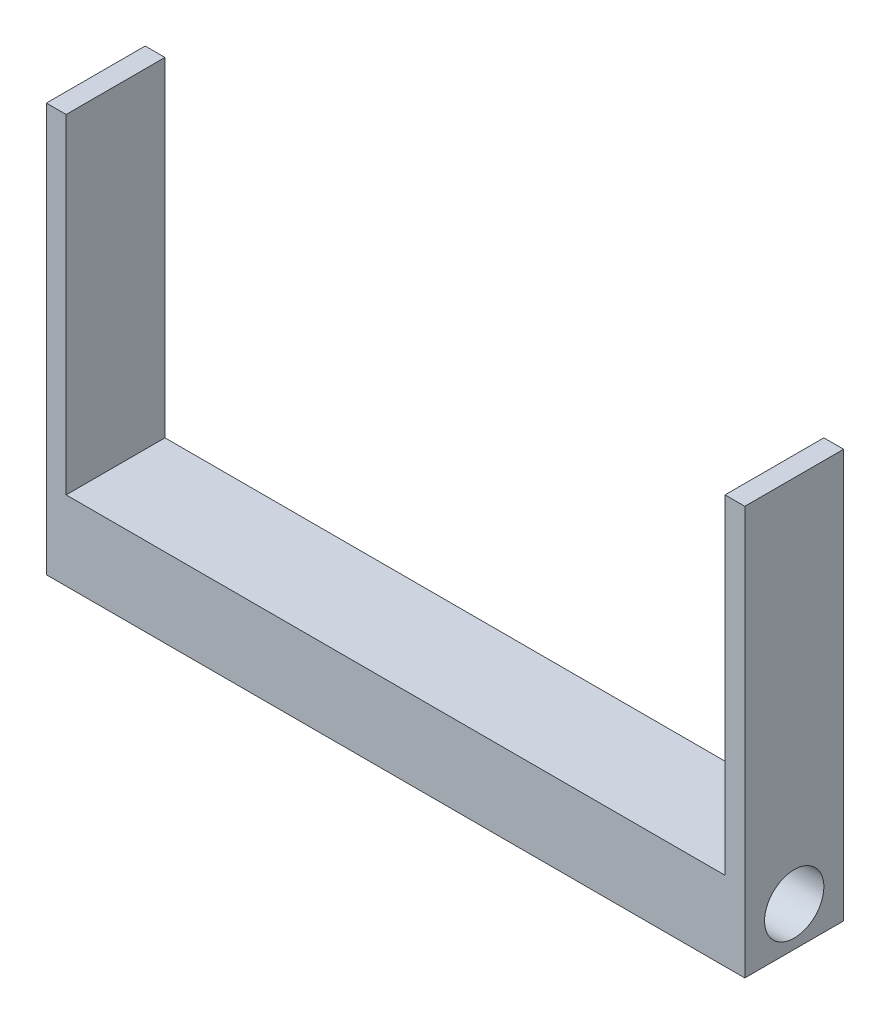
ISO-10303-21;
HEADER;
FILE_DESCRIPTION(('STEP AP214'),'2;1');
FILE_NAME('part.step','',(''),(''),'','','');
FILE_SCHEMA(('AUTOMOTIVE_DESIGN { 1 0 10303 214 1 1 1 1 }'));
ENDSEC;
DATA;
#1=APPLICATION_CONTEXT('core data for automotive mechanical design processes');
#2=APPLICATION_PROTOCOL_DEFINITION('international standard','automotive_design',2000,#1);
#3=PRODUCT_CONTEXT('',#1,'mechanical');
#4=PRODUCT('Part','Part','',(#3));
#5=PRODUCT_RELATED_PRODUCT_CATEGORY('part','',(#4));
#6=PRODUCT_DEFINITION_FORMATION('','',#4);
#7=PRODUCT_DEFINITION_CONTEXT('part definition',#1,'design');
#8=PRODUCT_DEFINITION('design','',#6,#7);
#9=PRODUCT_DEFINITION_SHAPE('','',#8);
#10=(LENGTH_UNIT() NAMED_UNIT(*) SI_UNIT(.MILLI.,.METRE.));
#11=(NAMED_UNIT(*) PLANE_ANGLE_UNIT() SI_UNIT($,.RADIAN.));
#12=(NAMED_UNIT(*) SI_UNIT($,.STERADIAN.) SOLID_ANGLE_UNIT());
#13=UNCERTAINTY_MEASURE_WITH_UNIT(LENGTH_MEASURE(1.E-05),#10,'distance_accuracy_value','');
#14=(GEOMETRIC_REPRESENTATION_CONTEXT(3) GLOBAL_UNCERTAINTY_ASSIGNED_CONTEXT((#13)) GLOBAL_UNIT_ASSIGNED_CONTEXT((#10,
#11,#12)) REPRESENTATION_CONTEXT('',''));
#15=CARTESIAN_POINT('',(0.,0.,0.));
#16=DIRECTION('',(0.,0.,1.));
#17=DIRECTION('',(1.,0.,0.));
#18=AXIS2_PLACEMENT_3D('',#15,#16,#17);
#19=CARTESIAN_POINT('',(53.,-50.,7.5));
#20=DIRECTION('',(-1.,0.,0.));
#21=DIRECTION('',(0.,-1.,0.));
#22=AXIS2_PLACEMENT_3D('',#19,#20,#21);
#23=PLANE('',#22);
#24=CARTESIAN_POINT('',(53.,-56.,0.));
#25=DIRECTION('',(1.,0.,0.));
#26=DIRECTION('',(0.,1.,0.));
#27=AXIS2_PLACEMENT_3D('',#24,#25,#26);
#28=CIRCLE('',#27,4.5);
#29=CARTESIAN_POINT('',(53.,-51.5,0.));
#30=VERTEX_POINT('',#29);
#31=EDGE_CURVE('E179',#30,#30,#28,.T.);
#32=ORIENTED_EDGE('',*,*,#31,.F.);
#33=EDGE_LOOP('',(#32));
#34=FACE_BOUND('',#33,.T.);
#35=DIRECTION('',(0.,1.,0.));
#36=VECTOR('',#35,1.);
#37=CARTESIAN_POINT('',(53.,-50.,-7.5));
#38=LINE('',#37,#36);
#39=CARTESIAN_POINT('',(53.,-62.,-7.5));
#40=VERTEX_POINT('',#39);
#41=CARTESIAN_POINT('',(53.,0.,-7.5));
#42=VERTEX_POINT('',#41);
#43=EDGE_CURVE('E129',#40,#42,#38,.T.);
#44=ORIENTED_EDGE('',*,*,#43,.T.);
#45=DIRECTION('',(0.,0.,-1.));
#46=VECTOR('',#45,1.);
#47=CARTESIAN_POINT('',(53.,0.,7.5));
#48=LINE('',#47,#46);
#49=CARTESIAN_POINT('',(53.,0.,7.5));
#50=VERTEX_POINT('',#49);
#51=EDGE_CURVE('E11',#50,#42,#48,.T.);
#52=ORIENTED_EDGE('',*,*,#51,.F.);
#53=DIRECTION('',(0.,1.,0.));
#54=VECTOR('',#53,1.);
#55=CARTESIAN_POINT('',(53.,-50.,7.5));
#56=LINE('',#55,#54);
#57=CARTESIAN_POINT('',(53.,-62.,7.5));
#58=VERTEX_POINT('',#57);
#59=EDGE_CURVE('E88',#58,#50,#56,.T.);
#60=ORIENTED_EDGE('',*,*,#59,.F.);
#61=DIRECTION('',(0.,0.,1.));
#62=VECTOR('',#61,1.);
#63=CARTESIAN_POINT('',(53.,-62.,-7.5));
#64=LINE('',#63,#62);
#65=EDGE_CURVE('E183',#40,#58,#64,.T.);
#66=ORIENTED_EDGE('',*,*,#65,.F.);
#67=EDGE_LOOP('',(#44,#52,#60,#66));
#68=FACE_BOUND('',#67,.T.);
#69=ADVANCED_FACE('F39',(#34,#68),#23,.F.);
#70=CARTESIAN_POINT('',(50.,0.,7.5));
#71=DIRECTION('',(0.,1.,0.));
#72=DIRECTION('',(0.,0.,1.));
#73=AXIS2_PLACEMENT_3D('',#70,#71,#72);
#74=PLANE('',#73);
#75=DIRECTION('',(1.,0.,0.));
#76=VECTOR('',#75,1.);
#77=CARTESIAN_POINT('',(50.,0.,-7.5));
#78=LINE('',#77,#76);
#79=CARTESIAN_POINT('',(50.,0.,-7.5));
#80=VERTEX_POINT('',#79);
#81=EDGE_CURVE('E132',#80,#42,#78,.T.);
#82=ORIENTED_EDGE('',*,*,#81,.F.);
#83=DIRECTION('',(0.,0.,-1.));
#84=VECTOR('',#83,1.);
#85=CARTESIAN_POINT('',(50.,0.,7.5));
#86=LINE('',#85,#84);
#87=CARTESIAN_POINT('',(50.,0.,7.5));
#88=VERTEX_POINT('',#87);
#89=EDGE_CURVE('E47',#88,#80,#86,.T.);
#90=ORIENTED_EDGE('',*,*,#89,.F.);
#91=DIRECTION('',(1.,0.,0.));
#92=VECTOR('',#91,1.);
#93=CARTESIAN_POINT('',(50.,0.,7.5));
#94=LINE('',#93,#92);
#95=EDGE_CURVE('E203',#88,#50,#94,.T.);
#96=ORIENTED_EDGE('',*,*,#95,.T.);
#97=ORIENTED_EDGE('',*,*,#51,.T.);
#98=EDGE_LOOP('',(#82,#90,#96,#97));
#99=FACE_BOUND('',#98,.T.);
#100=ADVANCED_FACE('F155',(#99),#74,.T.);
#101=CARTESIAN_POINT('',(50.,-50.,7.5));
#102=DIRECTION('',(-1.,0.,0.));
#103=DIRECTION('',(0.,-1.,0.));
#104=AXIS2_PLACEMENT_3D('',#101,#102,#103);
#105=PLANE('',#104);
#106=DIRECTION('',(0.,1.,0.));
#107=VECTOR('',#106,1.);
#108=CARTESIAN_POINT('',(50.,-50.,-7.5));
#109=LINE('',#108,#107);
#110=CARTESIAN_POINT('',(50.,-50.,-7.5));
#111=VERTEX_POINT('',#110);
#112=EDGE_CURVE('E136',#111,#80,#109,.T.);
#113=ORIENTED_EDGE('',*,*,#112,.F.);
#114=DIRECTION('',(0.,0.,-1.));
#115=VECTOR('',#114,1.);
#116=CARTESIAN_POINT('',(50.,-50.,7.5));
#117=LINE('',#116,#115);
#118=CARTESIAN_POINT('',(50.,-50.,7.5));
#119=VERTEX_POINT('',#118);
#120=EDGE_CURVE('E110',#119,#111,#117,.T.);
#121=ORIENTED_EDGE('',*,*,#120,.F.);
#122=DIRECTION('',(0.,1.,0.));
#123=VECTOR('',#122,1.);
#124=CARTESIAN_POINT('',(50.,-50.,7.5));
#125=LINE('',#124,#123);
#126=EDGE_CURVE('E118',#119,#88,#125,.T.);
#127=ORIENTED_EDGE('',*,*,#126,.T.);
#128=ORIENTED_EDGE('',*,*,#89,.T.);
#129=EDGE_LOOP('',(#113,#121,#127,#128));
#130=FACE_BOUND('',#129,.T.);
#131=ADVANCED_FACE('F152',(#130),#105,.T.);
#132=CARTESIAN_POINT('',(-50.,-50.,7.5));
#133=DIRECTION('',(0.,1.,0.));
#134=DIRECTION('',(-1.,0.,0.));
#135=AXIS2_PLACEMENT_3D('',#132,#133,#134);
#136=PLANE('',#135);
#137=DIRECTION('',(1.,0.,0.));
#138=VECTOR('',#137,1.);
#139=CARTESIAN_POINT('',(-50.,-50.,-7.5));
#140=LINE('',#139,#138);
#141=CARTESIAN_POINT('',(-50.,-50.,-7.5));
#142=VERTEX_POINT('',#141);
#143=EDGE_CURVE('E106',#142,#111,#140,.T.);
#144=ORIENTED_EDGE('',*,*,#143,.F.);
#145=DIRECTION('',(0.,0.,-1.));
#146=VECTOR('',#145,1.);
#147=CARTESIAN_POINT('',(-50.,-50.,7.5));
#148=LINE('',#147,#146);
#149=CARTESIAN_POINT('',(-50.,-50.,7.5));
#150=VERTEX_POINT('',#149);
#151=EDGE_CURVE('E101',#150,#142,#148,.T.);
#152=ORIENTED_EDGE('',*,*,#151,.F.);
#153=DIRECTION('',(1.,0.,0.));
#154=VECTOR('',#153,1.);
#155=CARTESIAN_POINT('',(-50.,-50.,7.5));
#156=LINE('',#155,#154);
#157=EDGE_CURVE('E104',#150,#119,#156,.T.);
#158=ORIENTED_EDGE('',*,*,#157,.T.);
#159=ORIENTED_EDGE('',*,*,#120,.T.);
#160=EDGE_LOOP('',(#144,#152,#158,#159));
#161=FACE_BOUND('',#160,.T.);
#162=ADVANCED_FACE('F103',(#161),#136,.T.);
#163=CARTESIAN_POINT('',(-50.,0.,7.5));
#164=DIRECTION('',(1.,0.,0.));
#165=DIRECTION('',(0.,1.,0.));
#166=AXIS2_PLACEMENT_3D('',#163,#164,#165);
#167=PLANE('',#166);
#168=DIRECTION('',(0.,-1.,0.));
#169=VECTOR('',#168,1.);
#170=CARTESIAN_POINT('',(-50.,0.,-7.5));
#171=LINE('',#170,#169);
#172=CARTESIAN_POINT('',(-50.,0.,-7.5));
#173=VERTEX_POINT('',#172);
#174=EDGE_CURVE('E140',#173,#142,#171,.T.);
#175=ORIENTED_EDGE('',*,*,#174,.F.);
#176=DIRECTION('',(0.,0.,-1.));
#177=VECTOR('',#176,1.);
#178=CARTESIAN_POINT('',(-50.,0.,7.5));
#179=LINE('',#178,#177);
#180=CARTESIAN_POINT('',(-50.,0.,7.5));
#181=VERTEX_POINT('',#180);
#182=EDGE_CURVE('E75',#181,#173,#179,.T.);
#183=ORIENTED_EDGE('',*,*,#182,.F.);
#184=DIRECTION('',(0.,-1.,0.));
#185=VECTOR('',#184,1.);
#186=CARTESIAN_POINT('',(-50.,0.,7.5));
#187=LINE('',#186,#185);
#188=EDGE_CURVE('E116',#181,#150,#187,.T.);
#189=ORIENTED_EDGE('',*,*,#188,.T.);
#190=ORIENTED_EDGE('',*,*,#151,.T.);
#191=EDGE_LOOP('',(#175,#183,#189,#190));
#192=FACE_BOUND('',#191,.T.);
#193=ADVANCED_FACE('F120',(#192),#167,.T.);
#194=CARTESIAN_POINT('',(-53.,0.,7.5));
#195=DIRECTION('',(0.,1.,0.));
#196=DIRECTION('',(-1.,0.,0.));
#197=AXIS2_PLACEMENT_3D('',#194,#195,#196);
#198=PLANE('',#197);
#199=DIRECTION('',(1.,0.,0.));
#200=VECTOR('',#199,1.);
#201=CARTESIAN_POINT('',(-53.,0.,-7.5));
#202=LINE('',#201,#200);
#203=CARTESIAN_POINT('',(-53.,0.,-7.5));
#204=VERTEX_POINT('',#203);
#205=EDGE_CURVE('E142',#204,#173,#202,.T.);
#206=ORIENTED_EDGE('',*,*,#205,.F.);
#207=DIRECTION('',(0.,0.,-1.));
#208=VECTOR('',#207,1.);
#209=CARTESIAN_POINT('',(-53.,0.,7.5));
#210=LINE('',#209,#208);
#211=CARTESIAN_POINT('',(-53.,0.,7.5));
#212=VERTEX_POINT('',#211);
#213=EDGE_CURVE('E55',#212,#204,#210,.T.);
#214=ORIENTED_EDGE('',*,*,#213,.F.);
#215=DIRECTION('',(1.,0.,0.));
#216=VECTOR('',#215,1.);
#217=CARTESIAN_POINT('',(-53.,0.,7.5));
#218=LINE('',#217,#216);
#219=EDGE_CURVE('E121',#212,#181,#218,.T.);
#220=ORIENTED_EDGE('',*,*,#219,.T.);
#221=ORIENTED_EDGE('',*,*,#182,.T.);
#222=EDGE_LOOP('',(#206,#214,#220,#221));
#223=FACE_BOUND('',#222,.T.);
#224=ADVANCED_FACE('F160',(#223),#198,.T.);
#225=CARTESIAN_POINT('',(-53.,0.,7.5));
#226=DIRECTION('',(1.,0.,0.));
#227=DIRECTION('',(0.,1.,0.));
#228=AXIS2_PLACEMENT_3D('',#225,#226,#227);
#229=PLANE('',#228);
#230=CARTESIAN_POINT('',(-53.,-56.,0.));
#231=DIRECTION('',(1.,0.,0.));
#232=DIRECTION('',(0.,1.,0.));
#233=AXIS2_PLACEMENT_3D('',#230,#231,#232);
#234=CIRCLE('',#233,4.5);
#235=CARTESIAN_POINT('',(-53.,-51.5,0.));
#236=VERTEX_POINT('',#235);
#237=EDGE_CURVE('E197',#236,#236,#234,.T.);
#238=ORIENTED_EDGE('',*,*,#237,.T.);
#239=EDGE_LOOP('',(#238));
#240=FACE_BOUND('',#239,.T.);
#241=DIRECTION('',(0.,-1.,0.));
#242=VECTOR('',#241,1.);
#243=CARTESIAN_POINT('',(-53.,0.,-7.5));
#244=LINE('',#243,#242);
#245=CARTESIAN_POINT('',(-53.,-62.,-7.5));
#246=VERTEX_POINT('',#245);
#247=EDGE_CURVE('E145',#204,#246,#244,.T.);
#248=ORIENTED_EDGE('',*,*,#247,.T.);
#249=DIRECTION('',(0.,0.,-1.));
#250=VECTOR('',#249,1.);
#251=CARTESIAN_POINT('',(-53.,-62.,7.5));
#252=LINE('',#251,#250);
#253=CARTESIAN_POINT('',(-53.,-62.,7.5));
#254=VERTEX_POINT('',#253);
#255=EDGE_CURVE('E194',#254,#246,#252,.T.);
#256=ORIENTED_EDGE('',*,*,#255,.F.);
#257=DIRECTION('',(0.,-1.,0.));
#258=VECTOR('',#257,1.);
#259=CARTESIAN_POINT('',(-53.,0.,7.5));
#260=LINE('',#259,#258);
#261=EDGE_CURVE('E123',#212,#254,#260,.T.);
#262=ORIENTED_EDGE('',*,*,#261,.F.);
#263=ORIENTED_EDGE('',*,*,#213,.T.);
#264=EDGE_LOOP('',(#248,#256,#262,#263));
#265=FACE_BOUND('',#264,.T.);
#266=ADVANCED_FACE('F162',(#240,#265),#229,.F.);
#267=CARTESIAN_POINT('',(0.,0.,7.5));
#268=DIRECTION('',(0.,0.,-1.));
#269=DIRECTION('',(-1.,0.,0.));
#270=AXIS2_PLACEMENT_3D('',#267,#268,#269);
#271=PLANE('',#270);
#272=ORIENTED_EDGE('',*,*,#59,.T.);
#273=ORIENTED_EDGE('',*,*,#95,.F.);
#274=ORIENTED_EDGE('',*,*,#126,.F.);
#275=ORIENTED_EDGE('',*,*,#157,.F.);
#276=ORIENTED_EDGE('',*,*,#188,.F.);
#277=ORIENTED_EDGE('',*,*,#219,.F.);
#278=ORIENTED_EDGE('',*,*,#261,.T.);
#279=DIRECTION('',(-1.,0.,0.));
#280=VECTOR('',#279,1.);
#281=CARTESIAN_POINT('',(53.,-62.,7.5));
#282=LINE('',#281,#280);
#283=EDGE_CURVE('E133',#58,#254,#282,.T.);
#284=ORIENTED_EDGE('',*,*,#283,.F.);
#285=EDGE_LOOP('',(#272,#273,#274,#275,#276,#277,#278,#284));
#286=FACE_BOUND('',#285,.T.);
#287=ADVANCED_FACE('F114',(#286),#271,.F.);
#288=CARTESIAN_POINT('',(0.,0.,-7.5));
#289=DIRECTION('',(0.,0.,-1.));
#290=DIRECTION('',(-1.,0.,0.));
#291=AXIS2_PLACEMENT_3D('',#288,#289,#290);
#292=PLANE('',#291);
#293=ORIENTED_EDGE('',*,*,#43,.F.);
#294=DIRECTION('',(1.,0.,0.));
#295=VECTOR('',#294,1.);
#296=CARTESIAN_POINT('',(-53.,-62.,-7.5));
#297=LINE('',#296,#295);
#298=EDGE_CURVE('E186',#246,#40,#297,.T.);
#299=ORIENTED_EDGE('',*,*,#298,.F.);
#300=ORIENTED_EDGE('',*,*,#247,.F.);
#301=ORIENTED_EDGE('',*,*,#205,.T.);
#302=ORIENTED_EDGE('',*,*,#174,.T.);
#303=ORIENTED_EDGE('',*,*,#143,.T.);
#304=ORIENTED_EDGE('',*,*,#112,.T.);
#305=ORIENTED_EDGE('',*,*,#81,.T.);
#306=EDGE_LOOP('',(#293,#299,#300,#301,#302,#303,#304,#305));
#307=FACE_BOUND('',#306,.T.);
#308=ADVANCED_FACE('F158',(#307),#292,.T.);
#309=CARTESIAN_POINT('',(0.,-62.,0.));
#310=DIRECTION('',(0.,-1.,0.));
#311=DIRECTION('',(1.,0.,0.));
#312=AXIS2_PLACEMENT_3D('',#309,#310,#311);
#313=PLANE('',#312);
#314=ORIENTED_EDGE('',*,*,#255,.T.);
#315=ORIENTED_EDGE('',*,*,#298,.T.);
#316=ORIENTED_EDGE('',*,*,#65,.T.);
#317=ORIENTED_EDGE('',*,*,#283,.T.);
#318=EDGE_LOOP('',(#314,#315,#316,#317));
#319=FACE_BOUND('',#318,.T.);
#320=ADVANCED_FACE('F191',(#319),#313,.T.);
#321=CARTESIAN_POINT('',(-53.,-56.,0.));
#322=DIRECTION('',(1.,0.,0.));
#323=DIRECTION('',(0.,1.,0.));
#324=AXIS2_PLACEMENT_3D('',#321,#322,#323);
#325=CYLINDRICAL_SURFACE('',#324,4.5);
#326=CARTESIAN_POINT('',(-53.,-51.5,0.));
#327=CARTESIAN_POINT('',(-51.8958333333333,-51.5,0.));
#328=CARTESIAN_POINT('',(-50.7916666666667,-51.5,0.));
#329=CARTESIAN_POINT('',(-48.5833333333333,-51.5,0.));
#330=CARTESIAN_POINT('',(-47.4791666666667,-51.5,0.));
#331=CARTESIAN_POINT('',(-45.2708333333333,-51.5,0.));
#332=CARTESIAN_POINT('',(-44.1666666666667,-51.5,0.));
#333=CARTESIAN_POINT('',(-41.9583333333333,-51.5,0.));
#334=CARTESIAN_POINT('',(-40.8541666666667,-51.5,0.));
#335=CARTESIAN_POINT('',(-38.6458333333333,-51.5,0.));
#336=CARTESIAN_POINT('',(-37.5416666666667,-51.5,0.));
#337=CARTESIAN_POINT('',(-35.3333333333333,-51.5,0.));
#338=CARTESIAN_POINT('',(-34.2291666666667,-51.5,0.));
#339=CARTESIAN_POINT('',(-32.0208333333333,-51.5,0.));
#340=CARTESIAN_POINT('',(-30.9166666666667,-51.5,0.));
#341=CARTESIAN_POINT('',(-28.7083333333333,-51.5,0.));
#342=CARTESIAN_POINT('',(-27.6041666666667,-51.5,0.));
#343=CARTESIAN_POINT('',(-25.3958333333333,-51.5,0.));
#344=CARTESIAN_POINT('',(-24.2916666666667,-51.5,0.));
#345=CARTESIAN_POINT('',(-22.0833333333333,-51.5,0.));
#346=CARTESIAN_POINT('',(-20.9791666666667,-51.5,0.));
#347=CARTESIAN_POINT('',(-18.7708333333333,-51.5,0.));
#348=CARTESIAN_POINT('',(-17.6666666666667,-51.5,0.));
#349=CARTESIAN_POINT('',(-15.4583333333333,-51.5,0.));
#350=CARTESIAN_POINT('',(-14.3541666666667,-51.5,0.));
#351=CARTESIAN_POINT('',(-12.1458333333333,-51.5,0.));
#352=CARTESIAN_POINT('',(-11.0416666666667,-51.5,0.));
#353=CARTESIAN_POINT('',(-8.83333333333334,-51.5,0.));
#354=CARTESIAN_POINT('',(-7.72916666666667,-51.5,0.));
#355=CARTESIAN_POINT('',(-5.52083333333334,-51.5,0.));
#356=CARTESIAN_POINT('',(-4.41666666666667,-51.5,0.));
#357=CARTESIAN_POINT('',(-2.20833333333334,-51.5,0.));
#358=CARTESIAN_POINT('',(-1.10416666666667,-51.5,0.));
#359=CARTESIAN_POINT('',(1.10416666666667,-51.5,0.));
#360=CARTESIAN_POINT('',(2.20833333333334,-51.5,0.));
#361=CARTESIAN_POINT('',(4.41666666666667,-51.5,0.));
#362=CARTESIAN_POINT('',(5.52083333333334,-51.5,0.));
#363=CARTESIAN_POINT('',(7.72916666666667,-51.5,0.));
#364=CARTESIAN_POINT('',(8.83333333333334,-51.5,0.));
#365=CARTESIAN_POINT('',(11.0416666666667,-51.5,0.));
#366=CARTESIAN_POINT('',(12.1458333333333,-51.5,0.));
#367=CARTESIAN_POINT('',(14.3541666666667,-51.5,0.));
#368=CARTESIAN_POINT('',(15.4583333333333,-51.5,0.));
#369=CARTESIAN_POINT('',(17.6666666666667,-51.5,0.));
#370=CARTESIAN_POINT('',(18.7708333333333,-51.5,0.));
#371=CARTESIAN_POINT('',(20.9791666666667,-51.5,0.));
#372=CARTESIAN_POINT('',(22.0833333333333,-51.5,0.));
#373=CARTESIAN_POINT('',(24.2916666666667,-51.5,0.));
#374=CARTESIAN_POINT('',(25.3958333333333,-51.5,0.));
#375=CARTESIAN_POINT('',(27.6041666666667,-51.5,0.));
#376=CARTESIAN_POINT('',(28.7083333333333,-51.5,0.));
#377=CARTESIAN_POINT('',(30.9166666666667,-51.5,0.));
#378=CARTESIAN_POINT('',(32.0208333333333,-51.5,0.));
#379=CARTESIAN_POINT('',(34.2291666666667,-51.5,0.));
#380=CARTESIAN_POINT('',(35.3333333333333,-51.5,0.));
#381=CARTESIAN_POINT('',(37.5416666666667,-51.5,0.));
#382=CARTESIAN_POINT('',(38.6458333333333,-51.5,0.));
#383=CARTESIAN_POINT('',(40.8541666666667,-51.5,0.));
#384=CARTESIAN_POINT('',(41.9583333333333,-51.5,0.));
#385=CARTESIAN_POINT('',(44.1666666666667,-51.5,0.));
#386=CARTESIAN_POINT('',(45.2708333333333,-51.5,0.));
#387=CARTESIAN_POINT('',(47.4791666666667,-51.5,0.));
#388=CARTESIAN_POINT('',(48.5833333333333,-51.5,0.));
#389=CARTESIAN_POINT('',(50.7916666666667,-51.5,0.));
#390=CARTESIAN_POINT('',(51.8958333333333,-51.5,0.));
#391=CARTESIAN_POINT('',(53.,-51.5,0.));
#392=B_SPLINE_CURVE_WITH_KNOTS('',3,(#326,#327,#328,#329,#330,#331,#332,#333,#334,#335,#336,
#337,#338,#339,#340,#341,#342,#343,#344,#345,#346,#347,#348,#349,#350,#351,#352,#353,#354,#355,
#356,#357,#358,#359,#360,#361,#362,#363,#364,#365,#366,#367,#368,#369,#370,#371,#372,#373,#374,
#375,#376,#377,#378,#379,#380,#381,#382,#383,#384,#385,#386,#387,#388,#389,#390,#391),
.UNSPECIFIED.,.F.,.F.,(4,2,2,2,2,2,2,2,2,2,2,2,2,2,2,2,2,2,2,2,2,2,2,2,2,2,2,2,2,2,2,2,4),(0.,
3.3125,6.62500000000001,9.93750000000001,13.25,16.5625,19.875,23.1875,26.5,29.8125,33.125,
36.4375,39.75,43.0625,46.375,49.6875,53.,56.3125,59.625,62.9375,66.25,69.5625,72.875,76.1875,
79.5,82.8125,86.125,89.4375,92.75,96.0625,99.375,102.6875,106.),.UNSPECIFIED.);
#393=EDGE_CURVE('BSEAM209',#236,#30,#392,.T.);
#394=ORIENTED_EDGE('',*,*,#237,.F.);
#395=ORIENTED_EDGE('',*,*,#31,.T.);
#396=ORIENTED_EDGE('',*,*,#393,.T.);
#397=ORIENTED_EDGE('',*,*,#393,.F.);
#398=EDGE_LOOP('',(#394,#396,#395,#397));
#399=FACE_BOUND('',#398,.T.);
#400=ADVANCED_FACE('F209',(#399),#325,.F.);
#401=CLOSED_SHELL('',(#69,#100,#131,#162,#193,#224,#266,#287,#308,#320,#400));
#402=MANIFOLD_SOLID_BREP('B2',#401);
#403=ADVANCED_BREP_SHAPE_REPRESENTATION('',(#18,#402),#14);
#404=SHAPE_DEFINITION_REPRESENTATION(#9,#403);
ENDSEC;
END-ISO-10303-21;
